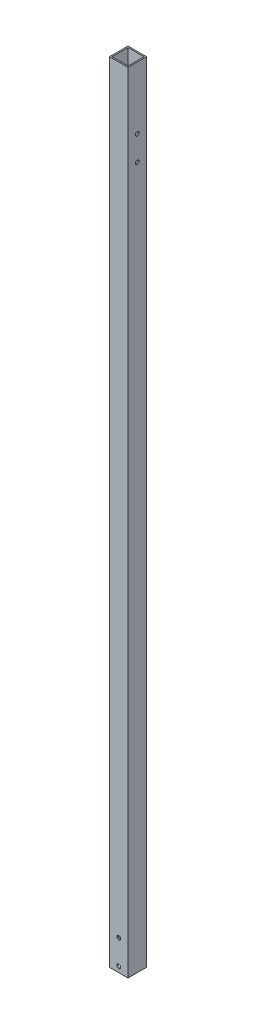
ISO-10303-21;
HEADER;
FILE_DESCRIPTION(('STEP AP214'),'2;1');
FILE_NAME('part.step','',(''),(''),'','','');
FILE_SCHEMA(('AUTOMOTIVE_DESIGN { 1 0 10303 214 1 1 1 1 }'));
ENDSEC;
DATA;
#1=APPLICATION_CONTEXT('core data for automotive mechanical design processes');
#2=APPLICATION_PROTOCOL_DEFINITION('international standard','automotive_design',2000,#1);
#3=PRODUCT_CONTEXT('',#1,'mechanical');
#4=PRODUCT('Part','Part','',(#3));
#5=PRODUCT_RELATED_PRODUCT_CATEGORY('part','',(#4));
#6=PRODUCT_DEFINITION_FORMATION('','',#4);
#7=PRODUCT_DEFINITION_CONTEXT('part definition',#1,'design');
#8=PRODUCT_DEFINITION('design','',#6,#7);
#9=PRODUCT_DEFINITION_SHAPE('','',#8);
#10=(LENGTH_UNIT() NAMED_UNIT(*) SI_UNIT(.MILLI.,.METRE.));
#11=(NAMED_UNIT(*) PLANE_ANGLE_UNIT() SI_UNIT($,.RADIAN.));
#12=(NAMED_UNIT(*) SI_UNIT($,.STERADIAN.) SOLID_ANGLE_UNIT());
#13=UNCERTAINTY_MEASURE_WITH_UNIT(LENGTH_MEASURE(1.E-05),#10,'distance_accuracy_value','');
#14=(GEOMETRIC_REPRESENTATION_CONTEXT(3) GLOBAL_UNCERTAINTY_ASSIGNED_CONTEXT((#13)) GLOBAL_UNIT_ASSIGNED_CONTEXT((#10,
#11,#12)) REPRESENTATION_CONTEXT('',''));
#15=CARTESIAN_POINT('',(0.,0.,0.));
#16=DIRECTION('',(0.,0.,1.));
#17=DIRECTION('',(1.,0.,0.));
#18=AXIS2_PLACEMENT_3D('',#15,#16,#17);
#19=CARTESIAN_POINT('',(0.,640.,0.));
#20=DIRECTION('',(0.,1.,0.));
#21=DIRECTION('',(0.,0.,1.));
#22=AXIS2_PLACEMENT_3D('',#19,#20,#21);
#23=PLANE('',#22);
#24=DIRECTION('',(0.,0.,-1.));
#25=VECTOR('',#24,1.);
#26=CARTESIAN_POINT('',(7.5,640.,7.5));
#27=LINE('',#26,#25);
#28=CARTESIAN_POINT('',(7.5,640.,7.5));
#29=VERTEX_POINT('',#28);
#30=CARTESIAN_POINT('',(7.5,640.,-7.5));
#31=VERTEX_POINT('',#30);
#32=EDGE_CURVE('E186',#29,#31,#27,.T.);
#33=ORIENTED_EDGE('',*,*,#32,.T.);
#34=DIRECTION('',(-1.,0.,0.));
#35=VECTOR('',#34,1.);
#36=CARTESIAN_POINT('',(-7.5,640.,-7.5));
#37=LINE('',#36,#35);
#38=CARTESIAN_POINT('',(-7.5,640.,-7.5));
#39=VERTEX_POINT('',#38);
#40=EDGE_CURVE('E190',#31,#39,#37,.T.);
#41=ORIENTED_EDGE('',*,*,#40,.T.);
#42=DIRECTION('',(0.,0.,1.));
#43=VECTOR('',#42,1.);
#44=CARTESIAN_POINT('',(-7.5,640.,7.5));
#45=LINE('',#44,#43);
#46=CARTESIAN_POINT('',(-7.5,640.,7.5));
#47=VERTEX_POINT('',#46);
#48=EDGE_CURVE('E194',#39,#47,#45,.T.);
#49=ORIENTED_EDGE('',*,*,#48,.T.);
#50=DIRECTION('',(1.,0.,0.));
#51=VECTOR('',#50,1.);
#52=CARTESIAN_POINT('',(-7.5,640.,7.5));
#53=LINE('',#52,#51);
#54=EDGE_CURVE('E197',#47,#29,#53,.T.);
#55=ORIENTED_EDGE('',*,*,#54,.T.);
#56=EDGE_LOOP('',(#33,#41,#49,#55));
#57=FACE_BOUND('',#56,.T.);
#58=DIRECTION('',(-1.,0.,0.));
#59=VECTOR('',#58,1.);
#60=CARTESIAN_POINT('',(0.,640.,-6.5));
#61=LINE('',#60,#59);
#62=CARTESIAN_POINT('',(6.5,640.,-6.5));
#63=VERTEX_POINT('',#62);
#64=CARTESIAN_POINT('',(-6.5,640.,-6.5));
#65=VERTEX_POINT('',#64);
#66=EDGE_CURVE('E145',#63,#65,#61,.T.);
#67=ORIENTED_EDGE('',*,*,#66,.F.);
#68=DIRECTION('',(0.,0.,-1.));
#69=VECTOR('',#68,1.);
#70=CARTESIAN_POINT('',(6.5,640.,0.));
#71=LINE('',#70,#69);
#72=CARTESIAN_POINT('',(6.5,640.,6.5));
#73=VERTEX_POINT('',#72);
#74=EDGE_CURVE('E136',#73,#63,#71,.T.);
#75=ORIENTED_EDGE('',*,*,#74,.F.);
#76=DIRECTION('',(1.,0.,0.));
#77=VECTOR('',#76,1.);
#78=CARTESIAN_POINT('',(0.,640.,6.5));
#79=LINE('',#78,#77);
#80=CARTESIAN_POINT('',(-6.5,640.,6.5));
#81=VERTEX_POINT('',#80);
#82=EDGE_CURVE('E162',#81,#73,#79,.T.);
#83=ORIENTED_EDGE('',*,*,#82,.F.);
#84=DIRECTION('',(0.,0.,1.));
#85=VECTOR('',#84,1.);
#86=CARTESIAN_POINT('',(-6.5,640.,0.));
#87=LINE('',#86,#85);
#88=EDGE_CURVE('E158',#65,#81,#87,.T.);
#89=ORIENTED_EDGE('',*,*,#88,.F.);
#90=EDGE_LOOP('',(#67,#75,#83,#89));
#91=FACE_BOUND('',#90,.T.);
#92=ADVANCED_FACE('F68',(#57,#91),#23,.T.);
#93=CARTESIAN_POINT('',(0.,0.,0.));
#94=DIRECTION('',(0.,1.,0.));
#95=DIRECTION('',(0.,0.,1.));
#96=AXIS2_PLACEMENT_3D('',#93,#94,#95);
#97=PLANE('',#96);
#98=DIRECTION('',(0.,0.,-1.));
#99=VECTOR('',#98,1.);
#100=CARTESIAN_POINT('',(7.5,0.,7.5));
#101=LINE('',#100,#99);
#102=CARTESIAN_POINT('',(7.5,0.,7.5));
#103=VERTEX_POINT('',#102);
#104=CARTESIAN_POINT('',(7.5,0.,-7.5));
#105=VERTEX_POINT('',#104);
#106=EDGE_CURVE('E154',#103,#105,#101,.T.);
#107=ORIENTED_EDGE('',*,*,#106,.F.);
#108=DIRECTION('',(1.,0.,0.));
#109=VECTOR('',#108,1.);
#110=CARTESIAN_POINT('',(-7.5,0.,7.5));
#111=LINE('',#110,#109);
#112=CARTESIAN_POINT('',(-7.5,0.,7.5));
#113=VERTEX_POINT('',#112);
#114=EDGE_CURVE('E191',#113,#103,#111,.T.);
#115=ORIENTED_EDGE('',*,*,#114,.F.);
#116=DIRECTION('',(0.,0.,1.));
#117=VECTOR('',#116,1.);
#118=CARTESIAN_POINT('',(-7.5,0.,7.5));
#119=LINE('',#118,#117);
#120=CARTESIAN_POINT('',(-7.5,0.,-7.5));
#121=VERTEX_POINT('',#120);
#122=EDGE_CURVE('E207',#121,#113,#119,.T.);
#123=ORIENTED_EDGE('',*,*,#122,.F.);
#124=DIRECTION('',(-1.,0.,0.));
#125=VECTOR('',#124,1.);
#126=CARTESIAN_POINT('',(-7.5,0.,-7.5));
#127=LINE('',#126,#125);
#128=EDGE_CURVE('E204',#105,#121,#127,.T.);
#129=ORIENTED_EDGE('',*,*,#128,.F.);
#130=EDGE_LOOP('',(#107,#115,#123,#129));
#131=FACE_BOUND('',#130,.T.);
#132=DIRECTION('',(0.,0.,-1.));
#133=VECTOR('',#132,1.);
#134=CARTESIAN_POINT('',(6.5,0.,0.));
#135=LINE('',#134,#133);
#136=CARTESIAN_POINT('',(6.5,0.,6.5));
#137=VERTEX_POINT('',#136);
#138=CARTESIAN_POINT('',(6.5,0.,-6.5));
#139=VERTEX_POINT('',#138);
#140=EDGE_CURVE('E94',#137,#139,#135,.T.);
#141=ORIENTED_EDGE('',*,*,#140,.T.);
#142=DIRECTION('',(-1.,0.,0.));
#143=VECTOR('',#142,1.);
#144=CARTESIAN_POINT('',(0.,0.,-6.5));
#145=LINE('',#144,#143);
#146=CARTESIAN_POINT('',(-6.5,0.,-6.5));
#147=VERTEX_POINT('',#146);
#148=EDGE_CURVE('E152',#139,#147,#145,.T.);
#149=ORIENTED_EDGE('',*,*,#148,.T.);
#150=DIRECTION('',(0.,0.,1.));
#151=VECTOR('',#150,1.);
#152=CARTESIAN_POINT('',(-6.5,0.,0.));
#153=LINE('',#152,#151);
#154=CARTESIAN_POINT('',(-6.5,0.,6.5));
#155=VERTEX_POINT('',#154);
#156=EDGE_CURVE('E173',#147,#155,#153,.T.);
#157=ORIENTED_EDGE('',*,*,#156,.T.);
#158=DIRECTION('',(1.,0.,0.));
#159=VECTOR('',#158,1.);
#160=CARTESIAN_POINT('',(0.,0.,6.5));
#161=LINE('',#160,#159);
#162=EDGE_CURVE('E146',#155,#137,#161,.T.);
#163=ORIENTED_EDGE('',*,*,#162,.T.);
#164=EDGE_LOOP('',(#141,#149,#157,#163));
#165=FACE_BOUND('',#164,.T.);
#166=ADVANCED_FACE('F315',(#131,#165),#97,.F.);
#167=CARTESIAN_POINT('',(7.5,640.,7.5));
#168=DIRECTION('',(-1.,0.,0.));
#169=DIRECTION('',(0.,0.,1.));
#170=AXIS2_PLACEMENT_3D('',#167,#168,#169);
#171=PLANE('',#170);
#172=CARTESIAN_POINT('',(7.5,589.5,0.));
#173=DIRECTION('',(1.,0.,0.));
#174=DIRECTION('',(0.,0.,-1.));
#175=AXIS2_PLACEMENT_3D('',#172,#173,#174);
#176=CIRCLE('',#175,1.60000000000003);
#177=CARTESIAN_POINT('',(7.5,589.5,-1.60000000000003));
#178=VERTEX_POINT('',#177);
#179=EDGE_CURVE('E243',#178,#178,#176,.T.);
#180=ORIENTED_EDGE('',*,*,#179,.F.);
#181=EDGE_LOOP('',(#180));
#182=FACE_BOUND('',#181,.T.);
#183=CARTESIAN_POINT('',(7.5,569.5,0.));
#184=DIRECTION('',(1.,0.,0.));
#185=DIRECTION('',(0.,0.,-1.));
#186=AXIS2_PLACEMENT_3D('',#183,#184,#185);
#187=CIRCLE('',#186,1.60000000000003);
#188=CARTESIAN_POINT('',(7.5,569.5,-1.60000000000003));
#189=VERTEX_POINT('',#188);
#190=EDGE_CURVE('E249',#189,#189,#187,.T.);
#191=ORIENTED_EDGE('',*,*,#190,.F.);
#192=EDGE_LOOP('',(#191));
#193=FACE_BOUND('',#192,.T.);
#194=ORIENTED_EDGE('',*,*,#106,.T.);
#195=DIRECTION('',(0.,-1.,0.));
#196=VECTOR('',#195,1.);
#197=CARTESIAN_POINT('',(7.5,640.,-7.5));
#198=LINE('',#197,#196);
#199=EDGE_CURVE('E12',#31,#105,#198,.T.);
#200=ORIENTED_EDGE('',*,*,#199,.F.);
#201=ORIENTED_EDGE('',*,*,#32,.F.);
#202=DIRECTION('',(0.,-1.,0.));
#203=VECTOR('',#202,1.);
#204=CARTESIAN_POINT('',(7.5,640.,7.5));
#205=LINE('',#204,#203);
#206=EDGE_CURVE('E200',#29,#103,#205,.T.);
#207=ORIENTED_EDGE('',*,*,#206,.T.);
#208=EDGE_LOOP('',(#194,#200,#201,#207));
#209=FACE_BOUND('',#208,.T.);
#210=ADVANCED_FACE('F70',(#182,#193,#209),#171,.F.);
#211=CARTESIAN_POINT('',(-7.5,640.,-7.5));
#212=DIRECTION('',(0.,0.,1.));
#213=DIRECTION('',(1.,0.,0.));
#214=AXIS2_PLACEMENT_3D('',#211,#212,#213);
#215=PLANE('',#214);
#216=CARTESIAN_POINT('',(0.,4.5,-7.5));
#217=DIRECTION('',(0.,0.,1.));
#218=DIRECTION('',(1.,0.,0.));
#219=AXIS2_PLACEMENT_3D('',#216,#217,#218);
#220=CIRCLE('',#219,1.6);
#221=CARTESIAN_POINT('',(1.6,4.5,-7.5));
#222=VERTEX_POINT('',#221);
#223=EDGE_CURVE('E227',#222,#222,#220,.T.);
#224=ORIENTED_EDGE('',*,*,#223,.T.);
#225=EDGE_LOOP('',(#224));
#226=FACE_BOUND('',#225,.T.);
#227=CARTESIAN_POINT('',(0.,24.5,-7.5));
#228=DIRECTION('',(0.,0.,1.));
#229=DIRECTION('',(1.,0.,0.));
#230=AXIS2_PLACEMENT_3D('',#227,#228,#229);
#231=CIRCLE('',#230,1.6);
#232=CARTESIAN_POINT('',(1.6,24.5,-7.5));
#233=VERTEX_POINT('',#232);
#234=EDGE_CURVE('E263',#233,#233,#231,.T.);
#235=ORIENTED_EDGE('',*,*,#234,.T.);
#236=EDGE_LOOP('',(#235));
#237=FACE_BOUND('',#236,.T.);
#238=ORIENTED_EDGE('',*,*,#128,.T.);
#239=DIRECTION('',(0.,-1.,0.));
#240=VECTOR('',#239,1.);
#241=CARTESIAN_POINT('',(-7.5,640.,-7.5));
#242=LINE('',#241,#240);
#243=EDGE_CURVE('E78',#39,#121,#242,.T.);
#244=ORIENTED_EDGE('',*,*,#243,.F.);
#245=ORIENTED_EDGE('',*,*,#40,.F.);
#246=ORIENTED_EDGE('',*,*,#199,.T.);
#247=EDGE_LOOP('',(#238,#244,#245,#246));
#248=FACE_BOUND('',#247,.T.);
#249=ADVANCED_FACE('F301',(#226,#237,#248),#215,.F.);
#250=CARTESIAN_POINT('',(-7.5,640.,7.5));
#251=DIRECTION('',(1.,0.,0.));
#252=DIRECTION('',(0.,0.,-1.));
#253=AXIS2_PLACEMENT_3D('',#250,#251,#252);
#254=PLANE('',#253);
#255=CARTESIAN_POINT('',(-7.5,589.5,0.));
#256=DIRECTION('',(1.,0.,0.));
#257=DIRECTION('',(0.,0.,-1.));
#258=AXIS2_PLACEMENT_3D('',#255,#256,#257);
#259=CIRCLE('',#258,1.60000000000003);
#260=CARTESIAN_POINT('',(-7.5,589.5,-1.60000000000003));
#261=VERTEX_POINT('',#260);
#262=EDGE_CURVE('E235',#261,#261,#259,.T.);
#263=ORIENTED_EDGE('',*,*,#262,.T.);
#264=EDGE_LOOP('',(#263));
#265=FACE_BOUND('',#264,.T.);
#266=CARTESIAN_POINT('',(-7.5,569.5,0.));
#267=DIRECTION('',(1.,0.,0.));
#268=DIRECTION('',(0.,0.,-1.));
#269=AXIS2_PLACEMENT_3D('',#266,#267,#268);
#270=CIRCLE('',#269,1.60000000000003);
#271=CARTESIAN_POINT('',(-7.5,569.5,-1.60000000000003));
#272=VERTEX_POINT('',#271);
#273=EDGE_CURVE('E255',#272,#272,#270,.T.);
#274=ORIENTED_EDGE('',*,*,#273,.T.);
#275=EDGE_LOOP('',(#274));
#276=FACE_BOUND('',#275,.T.);
#277=ORIENTED_EDGE('',*,*,#122,.T.);
#278=DIRECTION('',(0.,-1.,0.));
#279=VECTOR('',#278,1.);
#280=CARTESIAN_POINT('',(-7.5,640.,7.5));
#281=LINE('',#280,#279);
#282=EDGE_CURVE('E215',#47,#113,#281,.T.);
#283=ORIENTED_EDGE('',*,*,#282,.F.);
#284=ORIENTED_EDGE('',*,*,#48,.F.);
#285=ORIENTED_EDGE('',*,*,#243,.T.);
#286=EDGE_LOOP('',(#277,#283,#284,#285));
#287=FACE_BOUND('',#286,.T.);
#288=ADVANCED_FACE('F304',(#265,#276,#287),#254,.F.);
#289=CARTESIAN_POINT('',(-7.5,640.,7.5));
#290=DIRECTION('',(0.,0.,-1.));
#291=DIRECTION('',(-1.,0.,0.));
#292=AXIS2_PLACEMENT_3D('',#289,#290,#291);
#293=PLANE('',#292);
#294=CARTESIAN_POINT('',(0.,4.5,7.5));
#295=DIRECTION('',(0.,0.,1.));
#296=DIRECTION('',(1.,0.,0.));
#297=AXIS2_PLACEMENT_3D('',#294,#295,#296);
#298=CIRCLE('',#297,1.6);
#299=CARTESIAN_POINT('',(1.6,4.5,7.5));
#300=VERTEX_POINT('',#299);
#301=EDGE_CURVE('E267',#300,#300,#298,.T.);
#302=ORIENTED_EDGE('',*,*,#301,.F.);
#303=EDGE_LOOP('',(#302));
#304=FACE_BOUND('',#303,.T.);
#305=CARTESIAN_POINT('',(0.,24.5,7.5));
#306=DIRECTION('',(0.,0.,1.));
#307=DIRECTION('',(1.,0.,0.));
#308=AXIS2_PLACEMENT_3D('',#305,#306,#307);
#309=CIRCLE('',#308,1.6);
#310=CARTESIAN_POINT('',(1.6,24.5,7.5));
#311=VERTEX_POINT('',#310);
#312=EDGE_CURVE('E271',#311,#311,#309,.T.);
#313=ORIENTED_EDGE('',*,*,#312,.F.);
#314=EDGE_LOOP('',(#313));
#315=FACE_BOUND('',#314,.T.);
#316=ORIENTED_EDGE('',*,*,#114,.T.);
#317=ORIENTED_EDGE('',*,*,#206,.F.);
#318=ORIENTED_EDGE('',*,*,#54,.F.);
#319=ORIENTED_EDGE('',*,*,#282,.T.);
#320=EDGE_LOOP('',(#316,#317,#318,#319));
#321=FACE_BOUND('',#320,.T.);
#322=ADVANCED_FACE('F319',(#304,#315,#321),#293,.F.);
#323=CARTESIAN_POINT('',(6.5,640.,0.));
#324=DIRECTION('',(-1.,0.,0.));
#325=DIRECTION('',(0.,0.,1.));
#326=AXIS2_PLACEMENT_3D('',#323,#324,#325);
#327=PLANE('',#326);
#328=CARTESIAN_POINT('',(6.5,589.5,0.));
#329=DIRECTION('',(-1.,0.,0.));
#330=DIRECTION('',(0.,0.,1.));
#331=AXIS2_PLACEMENT_3D('',#328,#329,#330);
#332=CIRCLE('',#331,1.60000000000003);
#333=CARTESIAN_POINT('',(6.5,589.5,1.60000000000003));
#334=VERTEX_POINT('',#333);
#335=EDGE_CURVE('E259',#334,#334,#332,.T.);
#336=ORIENTED_EDGE('',*,*,#335,.F.);
#337=EDGE_LOOP('',(#336));
#338=FACE_BOUND('',#337,.T.);
#339=CARTESIAN_POINT('',(6.5,569.5,0.));
#340=DIRECTION('',(-1.,0.,0.));
#341=DIRECTION('',(0.,0.,1.));
#342=AXIS2_PLACEMENT_3D('',#339,#340,#341);
#343=CIRCLE('',#342,1.60000000000003);
#344=CARTESIAN_POINT('',(6.5,569.5,1.60000000000003));
#345=VERTEX_POINT('',#344);
#346=EDGE_CURVE('E234',#345,#345,#343,.T.);
#347=ORIENTED_EDGE('',*,*,#346,.F.);
#348=EDGE_LOOP('',(#347));
#349=FACE_BOUND('',#348,.T.);
#350=ORIENTED_EDGE('',*,*,#140,.F.);
#351=DIRECTION('',(0.,-1.,0.));
#352=VECTOR('',#351,1.);
#353=CARTESIAN_POINT('',(6.5,640.,6.5));
#354=LINE('',#353,#352);
#355=EDGE_CURVE('E140',#73,#137,#354,.T.);
#356=ORIENTED_EDGE('',*,*,#355,.F.);
#357=ORIENTED_EDGE('',*,*,#74,.T.);
#358=DIRECTION('',(0.,-1.,0.));
#359=VECTOR('',#358,1.);
#360=CARTESIAN_POINT('',(6.5,640.,-6.5));
#361=LINE('',#360,#359);
#362=EDGE_CURVE('E139',#63,#139,#361,.T.);
#363=ORIENTED_EDGE('',*,*,#362,.T.);
#364=EDGE_LOOP('',(#350,#356,#357,#363));
#365=FACE_BOUND('',#364,.T.);
#366=ADVANCED_FACE('F138',(#338,#349,#365),#327,.T.);
#367=CARTESIAN_POINT('',(0.,640.,-6.5));
#368=DIRECTION('',(0.,0.,1.));
#369=DIRECTION('',(1.,0.,0.));
#370=AXIS2_PLACEMENT_3D('',#367,#368,#369);
#371=PLANE('',#370);
#372=CARTESIAN_POINT('',(0.,4.5,-6.5));
#373=DIRECTION('',(0.,0.,1.));
#374=DIRECTION('',(1.,0.,0.));
#375=AXIS2_PLACEMENT_3D('',#372,#373,#374);
#376=CIRCLE('',#375,1.6);
#377=CARTESIAN_POINT('',(1.6,4.5,-6.5));
#378=VERTEX_POINT('',#377);
#379=EDGE_CURVE('E170',#378,#378,#376,.T.);
#380=ORIENTED_EDGE('',*,*,#379,.F.);
#381=EDGE_LOOP('',(#380));
#382=FACE_BOUND('',#381,.T.);
#383=CARTESIAN_POINT('',(0.,24.5,-6.5));
#384=DIRECTION('',(0.,0.,1.));
#385=DIRECTION('',(1.,0.,0.));
#386=AXIS2_PLACEMENT_3D('',#383,#384,#385);
#387=CIRCLE('',#386,1.6);
#388=CARTESIAN_POINT('',(1.6,24.5,-6.5));
#389=VERTEX_POINT('',#388);
#390=EDGE_CURVE('E226',#389,#389,#387,.T.);
#391=ORIENTED_EDGE('',*,*,#390,.F.);
#392=EDGE_LOOP('',(#391));
#393=FACE_BOUND('',#392,.T.);
#394=ORIENTED_EDGE('',*,*,#148,.F.);
#395=ORIENTED_EDGE('',*,*,#362,.F.);
#396=ORIENTED_EDGE('',*,*,#66,.T.);
#397=DIRECTION('',(0.,-1.,0.));
#398=VECTOR('',#397,1.);
#399=CARTESIAN_POINT('',(-6.5,640.,-6.5));
#400=LINE('',#399,#398);
#401=EDGE_CURVE('E155',#65,#147,#400,.T.);
#402=ORIENTED_EDGE('',*,*,#401,.T.);
#403=EDGE_LOOP('',(#394,#395,#396,#402));
#404=FACE_BOUND('',#403,.T.);
#405=ADVANCED_FACE('F149',(#382,#393,#404),#371,.T.);
#406=CARTESIAN_POINT('',(-6.5,640.,0.));
#407=DIRECTION('',(1.,0.,0.));
#408=DIRECTION('',(0.,0.,-1.));
#409=AXIS2_PLACEMENT_3D('',#406,#407,#408);
#410=PLANE('',#409);
#411=CARTESIAN_POINT('',(-6.5,589.5,0.));
#412=DIRECTION('',(1.,0.,0.));
#413=DIRECTION('',(0.,0.,-1.));
#414=AXIS2_PLACEMENT_3D('',#411,#412,#413);
#415=CIRCLE('',#414,1.60000000000003);
#416=CARTESIAN_POINT('',(-6.5,589.5,-1.60000000000003));
#417=VERTEX_POINT('',#416);
#418=EDGE_CURVE('E72',#417,#417,#415,.T.);
#419=ORIENTED_EDGE('',*,*,#418,.F.);
#420=EDGE_LOOP('',(#419));
#421=FACE_BOUND('',#420,.T.);
#422=CARTESIAN_POINT('',(-6.5,569.5,0.));
#423=DIRECTION('',(1.,0.,0.));
#424=DIRECTION('',(0.,0.,-1.));
#425=AXIS2_PLACEMENT_3D('',#422,#423,#424);
#426=CIRCLE('',#425,1.60000000000003);
#427=CARTESIAN_POINT('',(-6.5,569.5,-1.60000000000003));
#428=VERTEX_POINT('',#427);
#429=EDGE_CURVE('E231',#428,#428,#426,.T.);
#430=ORIENTED_EDGE('',*,*,#429,.F.);
#431=EDGE_LOOP('',(#430));
#432=FACE_BOUND('',#431,.T.);
#433=ORIENTED_EDGE('',*,*,#156,.F.);
#434=ORIENTED_EDGE('',*,*,#401,.F.);
#435=ORIENTED_EDGE('',*,*,#88,.T.);
#436=DIRECTION('',(0.,-1.,0.));
#437=VECTOR('',#436,1.);
#438=CARTESIAN_POINT('',(-6.5,640.,6.5));
#439=LINE('',#438,#437);
#440=EDGE_CURVE('E86',#81,#155,#439,.T.);
#441=ORIENTED_EDGE('',*,*,#440,.T.);
#442=EDGE_LOOP('',(#433,#434,#435,#441));
#443=FACE_BOUND('',#442,.T.);
#444=ADVANCED_FACE('F289',(#421,#432,#443),#410,.T.);
#445=CARTESIAN_POINT('',(0.,640.,6.5));
#446=DIRECTION('',(0.,0.,-1.));
#447=DIRECTION('',(-1.,0.,0.));
#448=AXIS2_PLACEMENT_3D('',#445,#446,#447);
#449=PLANE('',#448);
#450=CARTESIAN_POINT('',(0.,4.5,6.5));
#451=DIRECTION('',(0.,0.,-1.));
#452=DIRECTION('',(-1.,0.,0.));
#453=AXIS2_PLACEMENT_3D('',#450,#451,#452);
#454=CIRCLE('',#453,1.6);
#455=CARTESIAN_POINT('',(-1.6,4.5,6.5));
#456=VERTEX_POINT('',#455);
#457=EDGE_CURVE('E228',#456,#456,#454,.T.);
#458=ORIENTED_EDGE('',*,*,#457,.F.);
#459=EDGE_LOOP('',(#458));
#460=FACE_BOUND('',#459,.T.);
#461=CARTESIAN_POINT('',(0.,24.5,6.5));
#462=DIRECTION('',(0.,0.,-1.));
#463=DIRECTION('',(-1.,0.,0.));
#464=AXIS2_PLACEMENT_3D('',#461,#462,#463);
#465=CIRCLE('',#464,1.6);
#466=CARTESIAN_POINT('',(-1.6,24.5,6.5));
#467=VERTEX_POINT('',#466);
#468=EDGE_CURVE('E222',#467,#467,#465,.T.);
#469=ORIENTED_EDGE('',*,*,#468,.F.);
#470=EDGE_LOOP('',(#469));
#471=FACE_BOUND('',#470,.T.);
#472=ORIENTED_EDGE('',*,*,#162,.F.);
#473=ORIENTED_EDGE('',*,*,#440,.F.);
#474=ORIENTED_EDGE('',*,*,#82,.T.);
#475=ORIENTED_EDGE('',*,*,#355,.T.);
#476=EDGE_LOOP('',(#472,#473,#474,#475));
#477=FACE_BOUND('',#476,.T.);
#478=ADVANCED_FACE('F398',(#460,#471,#477),#449,.T.);
#479=CARTESIAN_POINT('',(0.,24.5,-7.5));
#480=DIRECTION('',(0.,0.,1.));
#481=DIRECTION('',(1.,0.,0.));
#482=AXIS2_PLACEMENT_3D('',#479,#480,#481);
#483=CYLINDRICAL_SURFACE('',#482,1.6);
#484=ORIENTED_EDGE('',*,*,#468,.T.);
#485=EDGE_LOOP('',(#484));
#486=FACE_BOUND('',#485,.T.);
#487=ORIENTED_EDGE('',*,*,#312,.T.);
#488=EDGE_LOOP('',(#487));
#489=FACE_BOUND('',#488,.T.);
#490=ADVANCED_FACE('F298',(#486,#489),#483,.F.);
#491=CARTESIAN_POINT('',(0.,4.5,-7.5));
#492=DIRECTION('',(0.,0.,1.));
#493=DIRECTION('',(1.,0.,0.));
#494=AXIS2_PLACEMENT_3D('',#491,#492,#493);
#495=CYLINDRICAL_SURFACE('',#494,1.6);
#496=ORIENTED_EDGE('',*,*,#457,.T.);
#497=EDGE_LOOP('',(#496));
#498=FACE_BOUND('',#497,.T.);
#499=ORIENTED_EDGE('',*,*,#301,.T.);
#500=EDGE_LOOP('',(#499));
#501=FACE_BOUND('',#500,.T.);
#502=ADVANCED_FACE('F296',(#498,#501),#495,.F.);
#503=ORIENTED_EDGE('',*,*,#390,.T.);
#504=EDGE_LOOP('',(#503));
#505=FACE_BOUND('',#504,.T.);
#506=ORIENTED_EDGE('',*,*,#234,.F.);
#507=EDGE_LOOP('',(#506));
#508=FACE_BOUND('',#507,.T.);
#509=ADVANCED_FACE('F293',(#505,#508),#483,.F.);
#510=ORIENTED_EDGE('',*,*,#379,.T.);
#511=EDGE_LOOP('',(#510));
#512=FACE_BOUND('',#511,.T.);
#513=ORIENTED_EDGE('',*,*,#223,.F.);
#514=EDGE_LOOP('',(#513));
#515=FACE_BOUND('',#514,.T.);
#516=ADVANCED_FACE('F284',(#512,#515),#495,.F.);
#517=CARTESIAN_POINT('',(-7.5,569.5,0.));
#518=DIRECTION('',(1.,0.,0.));
#519=DIRECTION('',(0.,0.,-1.));
#520=AXIS2_PLACEMENT_3D('',#517,#518,#519);
#521=CYLINDRICAL_SURFACE('',#520,1.60000000000003);
#522=ORIENTED_EDGE('',*,*,#429,.T.);
#523=EDGE_LOOP('',(#522));
#524=FACE_BOUND('',#523,.T.);
#525=ORIENTED_EDGE('',*,*,#273,.F.);
#526=EDGE_LOOP('',(#525));
#527=FACE_BOUND('',#526,.T.);
#528=ADVANCED_FACE('F343',(#524,#527),#521,.F.);
#529=CARTESIAN_POINT('',(-7.5,589.5,0.));
#530=DIRECTION('',(1.,0.,0.));
#531=DIRECTION('',(0.,0.,-1.));
#532=AXIS2_PLACEMENT_3D('',#529,#530,#531);
#533=CYLINDRICAL_SURFACE('',#532,1.60000000000003);
#534=ORIENTED_EDGE('',*,*,#418,.T.);
#535=EDGE_LOOP('',(#534));
#536=FACE_BOUND('',#535,.T.);
#537=ORIENTED_EDGE('',*,*,#262,.F.);
#538=EDGE_LOOP('',(#537));
#539=FACE_BOUND('',#538,.T.);
#540=ADVANCED_FACE('F345',(#536,#539),#533,.F.);
#541=ORIENTED_EDGE('',*,*,#346,.T.);
#542=EDGE_LOOP('',(#541));
#543=FACE_BOUND('',#542,.T.);
#544=ORIENTED_EDGE('',*,*,#190,.T.);
#545=EDGE_LOOP('',(#544));
#546=FACE_BOUND('',#545,.T.);
#547=ADVANCED_FACE('F347',(#543,#546),#521,.F.);
#548=ORIENTED_EDGE('',*,*,#335,.T.);
#549=EDGE_LOOP('',(#548));
#550=FACE_BOUND('',#549,.T.);
#551=ORIENTED_EDGE('',*,*,#179,.T.);
#552=EDGE_LOOP('',(#551));
#553=FACE_BOUND('',#552,.T.);
#554=ADVANCED_FACE('F354',(#550,#553),#533,.F.);
#555=CLOSED_SHELL('',(#92,#166,#210,#249,#288,#322,#366,#405,#444,#478,#490,#502,#509,#516,#528,
#540,#547,#554));
#556=MANIFOLD_SOLID_BREP('B2',#555);
#557=ADVANCED_BREP_SHAPE_REPRESENTATION('',(#18,#556),#14);
#558=SHAPE_DEFINITION_REPRESENTATION(#9,#557);
ENDSEC;
END-ISO-10303-21;
